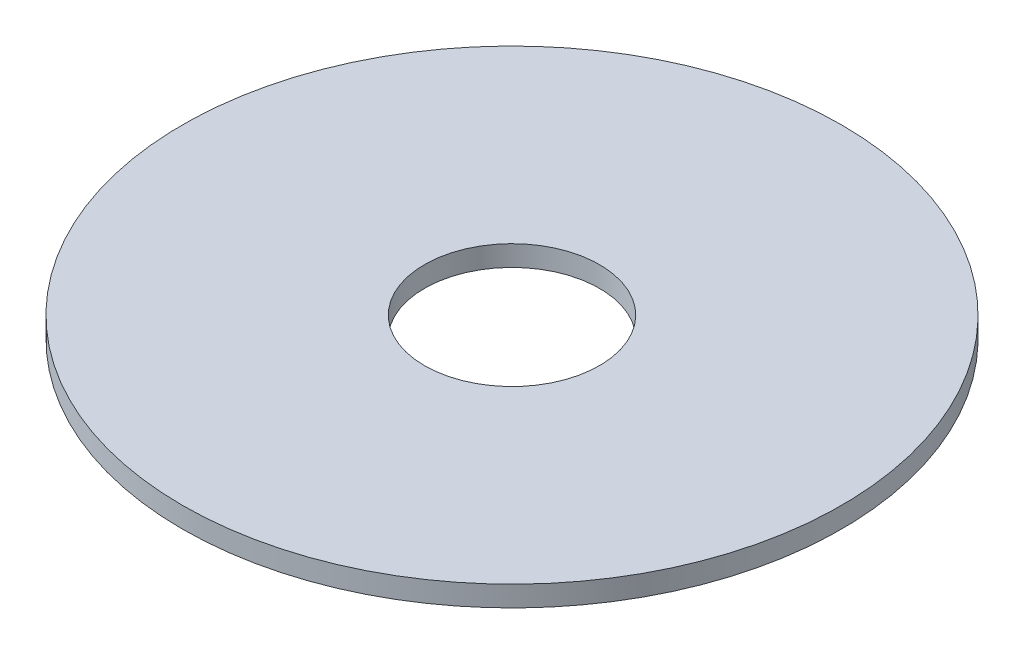
ISO-10303-21;
HEADER;
FILE_DESCRIPTION(('STEP AP214'),'2;1');
FILE_NAME('part.step','',(''),(''),'','','');
FILE_SCHEMA(('AUTOMOTIVE_DESIGN { 1 0 10303 214 1 1 1 1 }'));
ENDSEC;
DATA;
#1=APPLICATION_CONTEXT('core data for automotive mechanical design processes');
#2=APPLICATION_PROTOCOL_DEFINITION('international standard','automotive_design',2000,#1);
#3=PRODUCT_CONTEXT('',#1,'mechanical');
#4=PRODUCT('Part','Part','',(#3));
#5=PRODUCT_RELATED_PRODUCT_CATEGORY('part','',(#4));
#6=PRODUCT_DEFINITION_FORMATION('','',#4);
#7=PRODUCT_DEFINITION_CONTEXT('part definition',#1,'design');
#8=PRODUCT_DEFINITION('design','',#6,#7);
#9=PRODUCT_DEFINITION_SHAPE('','',#8);
#10=(LENGTH_UNIT() NAMED_UNIT(*) SI_UNIT(.MILLI.,.METRE.));
#11=(NAMED_UNIT(*) PLANE_ANGLE_UNIT() SI_UNIT($,.RADIAN.));
#12=(NAMED_UNIT(*) SI_UNIT($,.STERADIAN.) SOLID_ANGLE_UNIT());
#13=UNCERTAINTY_MEASURE_WITH_UNIT(LENGTH_MEASURE(1.E-05),#10,'distance_accuracy_value','');
#14=(GEOMETRIC_REPRESENTATION_CONTEXT(3) GLOBAL_UNCERTAINTY_ASSIGNED_CONTEXT((#13)) GLOBAL_UNIT_ASSIGNED_CONTEXT((#10,
#11,#12)) REPRESENTATION_CONTEXT('',''));
#15=CARTESIAN_POINT('',(0.,0.,0.));
#16=DIRECTION('',(0.,0.,1.));
#17=DIRECTION('',(1.,0.,0.));
#18=AXIS2_PLACEMENT_3D('',#15,#16,#17);
#19=CARTESIAN_POINT('',(0.,1.5875,0.));
#20=DIRECTION('',(0.,-1.,0.));
#21=DIRECTION('',(0.,0.,-1.));
#22=AXIS2_PLACEMENT_3D('',#19,#20,#21);
#23=CYLINDRICAL_SURFACE('',#22,25.4);
#24=CARTESIAN_POINT('',(0.,1.5875,0.));
#25=DIRECTION('',(0.,1.,0.));
#26=DIRECTION('',(0.,0.,1.));
#27=AXIS2_PLACEMENT_3D('',#24,#25,#26);
#28=CIRCLE('',#27,25.4);
#29=CARTESIAN_POINT('',(0.,1.5875,25.4));
#30=VERTEX_POINT('',#29);
#31=EDGE_CURVE('E10',#30,#30,#28,.T.);
#32=ORIENTED_EDGE('',*,*,#31,.F.);
#33=EDGE_LOOP('',(#32));
#34=FACE_BOUND('',#33,.T.);
#35=CARTESIAN_POINT('',(0.,0.,0.));
#36=DIRECTION('',(0.,1.,0.));
#37=DIRECTION('',(0.,0.,1.));
#38=AXIS2_PLACEMENT_3D('',#35,#36,#37);
#39=CIRCLE('',#38,25.4);
#40=CARTESIAN_POINT('',(0.,0.,25.4));
#41=VERTEX_POINT('',#40);
#42=EDGE_CURVE('E33',#41,#41,#39,.T.);
#43=ORIENTED_EDGE('',*,*,#42,.T.);
#44=EDGE_LOOP('',(#43));
#45=FACE_BOUND('',#44,.T.);
#46=ADVANCED_FACE('F30',(#34,#45),#23,.T.);
#47=CARTESIAN_POINT('',(0.,1.5875,0.));
#48=DIRECTION('',(0.,1.,0.));
#49=DIRECTION('',(0.,0.,1.));
#50=AXIS2_PLACEMENT_3D('',#47,#48,#49);
#51=PLANE('',#50);
#52=CARTESIAN_POINT('',(0.,1.5875,0.));
#53=DIRECTION('',(0.,1.,0.));
#54=DIRECTION('',(0.,0.,1.));
#55=AXIS2_PLACEMENT_3D('',#52,#53,#54);
#56=CIRCLE('',#55,6.74623999999999);
#57=CARTESIAN_POINT('',(0.,1.5875,6.74623999999999));
#58=VERTEX_POINT('',#57);
#59=EDGE_CURVE('E44',#58,#58,#56,.T.);
#60=ORIENTED_EDGE('',*,*,#59,.F.);
#61=EDGE_LOOP('',(#60));
#62=FACE_BOUND('',#61,.T.);
#63=ORIENTED_EDGE('',*,*,#31,.T.);
#64=EDGE_LOOP('',(#63));
#65=FACE_BOUND('',#64,.T.);
#66=ADVANCED_FACE('F50',(#62,#65),#51,.T.);
#67=CARTESIAN_POINT('',(0.,0.,0.));
#68=DIRECTION('',(0.,1.,0.));
#69=DIRECTION('',(0.,0.,1.));
#70=AXIS2_PLACEMENT_3D('',#67,#68,#69);
#71=PLANE('',#70);
#72=CARTESIAN_POINT('',(0.,0.,0.));
#73=DIRECTION('',(0.,1.,0.));
#74=DIRECTION('',(0.,0.,1.));
#75=AXIS2_PLACEMENT_3D('',#72,#73,#74);
#76=CIRCLE('',#75,6.74624);
#77=CARTESIAN_POINT('',(0.,0.,6.74624));
#78=VERTEX_POINT('',#77);
#79=EDGE_CURVE('E40',#78,#78,#76,.T.);
#80=ORIENTED_EDGE('',*,*,#79,.T.);
#81=EDGE_LOOP('',(#80));
#82=FACE_BOUND('',#81,.T.);
#83=ORIENTED_EDGE('',*,*,#42,.F.);
#84=EDGE_LOOP('',(#83));
#85=FACE_BOUND('',#84,.T.);
#86=ADVANCED_FACE('F52',(#82,#85),#71,.F.);
#87=CARTESIAN_POINT('',(0.,1.5875,0.));
#88=DIRECTION('',(0.,1.,0.));
#89=DIRECTION('',(0.,0.,1.));
#90=AXIS2_PLACEMENT_3D('',#87,#88,#89);
#91=CYLINDRICAL_SURFACE('',#90,6.74623999999999);
#92=ORIENTED_EDGE('',*,*,#79,.F.);
#93=EDGE_LOOP('',(#92));
#94=FACE_BOUND('',#93,.T.);
#95=ORIENTED_EDGE('',*,*,#59,.T.);
#96=EDGE_LOOP('',(#95));
#97=FACE_BOUND('',#96,.T.);
#98=ADVANCED_FACE('F48',(#94,#97),#91,.F.);
#99=CLOSED_SHELL('',(#46,#66,#86,#98));
#100=MANIFOLD_SOLID_BREP('B2',#99);
#101=ADVANCED_BREP_SHAPE_REPRESENTATION('',(#18,#100),#14);
#102=SHAPE_DEFINITION_REPRESENTATION(#9,#101);
ENDSEC;
END-ISO-10303-21;
